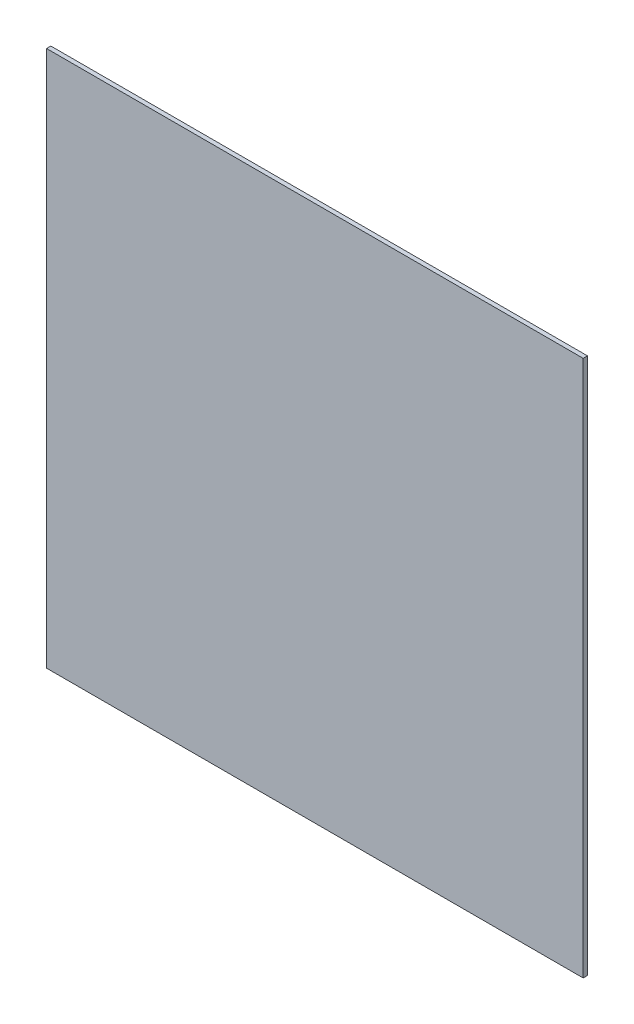
ISO-10303-21;
HEADER;
FILE_DESCRIPTION(('STEP AP214'),'2;1');
FILE_NAME('part.step','',(''),(''),'','','');
FILE_SCHEMA(('AUTOMOTIVE_DESIGN { 1 0 10303 214 1 1 1 1 }'));
ENDSEC;
DATA;
#1=APPLICATION_CONTEXT('core data for automotive mechanical design processes');
#2=APPLICATION_PROTOCOL_DEFINITION('international standard','automotive_design',2000,#1);
#3=PRODUCT_CONTEXT('',#1,'mechanical');
#4=PRODUCT('Part','Part','',(#3));
#5=PRODUCT_RELATED_PRODUCT_CATEGORY('part','',(#4));
#6=PRODUCT_DEFINITION_FORMATION('','',#4);
#7=PRODUCT_DEFINITION_CONTEXT('part definition',#1,'design');
#8=PRODUCT_DEFINITION('design','',#6,#7);
#9=PRODUCT_DEFINITION_SHAPE('','',#8);
#10=(LENGTH_UNIT() NAMED_UNIT(*) SI_UNIT(.MILLI.,.METRE.));
#11=(NAMED_UNIT(*) PLANE_ANGLE_UNIT() SI_UNIT($,.RADIAN.));
#12=(NAMED_UNIT(*) SI_UNIT($,.STERADIAN.) SOLID_ANGLE_UNIT());
#13=UNCERTAINTY_MEASURE_WITH_UNIT(LENGTH_MEASURE(1.E-05),#10,'distance_accuracy_value','');
#14=(GEOMETRIC_REPRESENTATION_CONTEXT(3) GLOBAL_UNCERTAINTY_ASSIGNED_CONTEXT((#13)) GLOBAL_UNIT_ASSIGNED_CONTEXT((#10,
#11,#12)) REPRESENTATION_CONTEXT('',''));
#15=CARTESIAN_POINT('',(0.,0.,0.));
#16=DIRECTION('',(0.,0.,1.));
#17=DIRECTION('',(1.,0.,0.));
#18=AXIS2_PLACEMENT_3D('',#15,#16,#17);
#19=CARTESIAN_POINT('',(0.,0.,0.02));
#20=DIRECTION('',(0.,0.,-1.));
#21=DIRECTION('',(0.,1.,0.));
#22=AXIS2_PLACEMENT_3D('',#19,#20,#21);
#23=PLANE('',#22);
#24=DIRECTION('',(0.,1.,0.));
#25=VECTOR('',#24,1.);
#26=CARTESIAN_POINT('',(-1.25,0.,0.02));
#27=LINE('',#26,#25);
#28=CARTESIAN_POINT('',(-1.25,1.25,0.02));
#29=VERTEX_POINT('',#28);
#30=CARTESIAN_POINT('',(-1.25,-1.25,0.02));
#31=VERTEX_POINT('',#30);
#32=EDGE_CURVE('E20',#29,#31,#27,.F.);
#33=ORIENTED_EDGE('',*,*,#32,.T.);
#34=DIRECTION('',(1.,0.,0.));
#35=VECTOR('',#34,1.);
#36=CARTESIAN_POINT('',(0.,-1.25,0.02));
#37=LINE('',#36,#35);
#38=CARTESIAN_POINT('',(1.25,-1.25,0.02));
#39=VERTEX_POINT('',#38);
#40=EDGE_CURVE('E81',#31,#39,#37,.T.);
#41=ORIENTED_EDGE('',*,*,#40,.T.);
#42=DIRECTION('',(0.,1.,0.));
#43=VECTOR('',#42,1.);
#44=CARTESIAN_POINT('',(1.25,0.,0.02));
#45=LINE('',#44,#43);
#46=CARTESIAN_POINT('',(1.25,1.25,0.02));
#47=VERTEX_POINT('',#46);
#48=EDGE_CURVE('E68',#39,#47,#45,.T.);
#49=ORIENTED_EDGE('',*,*,#48,.T.);
#50=DIRECTION('',(1.,0.,0.));
#51=VECTOR('',#50,1.);
#52=CARTESIAN_POINT('',(0.,1.25,0.02));
#53=LINE('',#52,#51);
#54=EDGE_CURVE('E55',#47,#29,#53,.F.);
#55=ORIENTED_EDGE('',*,*,#54,.T.);
#56=EDGE_LOOP('',(#33,#41,#49,#55));
#57=FACE_BOUND('',#56,.T.);
#58=ADVANCED_FACE('F17',(#57),#23,.F.);
#59=CARTESIAN_POINT('',(-1.25,0.,0.01));
#60=DIRECTION('',(1.,0.,0.));
#61=DIRECTION('',(0.,0.,-1.));
#62=AXIS2_PLACEMENT_3D('',#59,#60,#61);
#63=PLANE('',#62);
#64=DIRECTION('',(0.,0.,-1.));
#65=VECTOR('',#64,1.);
#66=CARTESIAN_POINT('',(-1.25,1.25,0.01));
#67=LINE('',#66,#65);
#68=CARTESIAN_POINT('',(-1.25,1.25,0.));
#69=VERTEX_POINT('',#68);
#70=EDGE_CURVE('E61',#29,#69,#67,.T.);
#71=ORIENTED_EDGE('',*,*,#70,.T.);
#72=DIRECTION('',(0.,1.,0.));
#73=VECTOR('',#72,1.);
#74=CARTESIAN_POINT('',(-1.25,0.,0.));
#75=LINE('',#74,#73);
#76=CARTESIAN_POINT('',(-1.25,-1.25,0.));
#77=VERTEX_POINT('',#76);
#78=EDGE_CURVE('E83',#77,#69,#75,.T.);
#79=ORIENTED_EDGE('',*,*,#78,.F.);
#80=DIRECTION('',(0.,0.,1.));
#81=VECTOR('',#80,1.);
#82=CARTESIAN_POINT('',(-1.25,-1.25,0.01));
#83=LINE('',#82,#81);
#84=EDGE_CURVE('E64',#77,#31,#83,.T.);
#85=ORIENTED_EDGE('',*,*,#84,.T.);
#86=ORIENTED_EDGE('',*,*,#32,.F.);
#87=EDGE_LOOP('',(#71,#79,#85,#86));
#88=FACE_BOUND('',#87,.T.);
#89=ADVANCED_FACE('F60',(#88),#63,.F.);
#90=CARTESIAN_POINT('',(0.,1.25,0.01));
#91=DIRECTION('',(0.,-1.,0.));
#92=DIRECTION('',(0.,0.,-1.));
#93=AXIS2_PLACEMENT_3D('',#90,#91,#92);
#94=PLANE('',#93);
#95=DIRECTION('',(0.,0.,1.));
#96=VECTOR('',#95,1.);
#97=CARTESIAN_POINT('',(1.25,1.25,0.01));
#98=LINE('',#97,#96);
#99=CARTESIAN_POINT('',(1.25,1.25,0.));
#100=VERTEX_POINT('',#99);
#101=EDGE_CURVE('E70',#47,#100,#98,.F.);
#102=ORIENTED_EDGE('',*,*,#101,.T.);
#103=DIRECTION('',(1.,0.,0.));
#104=VECTOR('',#103,1.);
#105=CARTESIAN_POINT('',(0.,1.25,0.));
#106=LINE('',#105,#104);
#107=EDGE_CURVE('E74',#69,#100,#106,.T.);
#108=ORIENTED_EDGE('',*,*,#107,.F.);
#109=ORIENTED_EDGE('',*,*,#70,.F.);
#110=ORIENTED_EDGE('',*,*,#54,.F.);
#111=EDGE_LOOP('',(#102,#108,#109,#110));
#112=FACE_BOUND('',#111,.T.);
#113=ADVANCED_FACE('F72',(#112),#94,.F.);
#114=CARTESIAN_POINT('',(1.25,0.,0.01));
#115=DIRECTION('',(-1.,0.,0.));
#116=DIRECTION('',(0.,0.,1.));
#117=AXIS2_PLACEMENT_3D('',#114,#115,#116);
#118=PLANE('',#117);
#119=DIRECTION('',(0.,0.,1.));
#120=VECTOR('',#119,1.);
#121=CARTESIAN_POINT('',(1.25,-1.25,0.01));
#122=LINE('',#121,#120);
#123=CARTESIAN_POINT('',(1.25,-1.25,0.));
#124=VERTEX_POINT('',#123);
#125=EDGE_CURVE('E35',#39,#124,#122,.F.);
#126=ORIENTED_EDGE('',*,*,#125,.T.);
#127=DIRECTION('',(0.,1.,0.));
#128=VECTOR('',#127,1.);
#129=CARTESIAN_POINT('',(1.25,0.,0.));
#130=LINE('',#129,#128);
#131=EDGE_CURVE('E26',#100,#124,#130,.F.);
#132=ORIENTED_EDGE('',*,*,#131,.F.);
#133=ORIENTED_EDGE('',*,*,#101,.F.);
#134=ORIENTED_EDGE('',*,*,#48,.F.);
#135=EDGE_LOOP('',(#126,#132,#133,#134));
#136=FACE_BOUND('',#135,.T.);
#137=ADVANCED_FACE('F89',(#136),#118,.F.);
#138=CARTESIAN_POINT('',(0.,-1.25,0.01));
#139=DIRECTION('',(0.,1.,0.));
#140=DIRECTION('',(0.,0.,1.));
#141=AXIS2_PLACEMENT_3D('',#138,#139,#140);
#142=PLANE('',#141);
#143=ORIENTED_EDGE('',*,*,#84,.F.);
#144=DIRECTION('',(1.,0.,0.));
#145=VECTOR('',#144,1.);
#146=CARTESIAN_POINT('',(0.,-1.25,0.));
#147=LINE('',#146,#145);
#148=EDGE_CURVE('E11',#124,#77,#147,.F.);
#149=ORIENTED_EDGE('',*,*,#148,.F.);
#150=ORIENTED_EDGE('',*,*,#125,.F.);
#151=ORIENTED_EDGE('',*,*,#40,.F.);
#152=EDGE_LOOP('',(#143,#149,#150,#151));
#153=FACE_BOUND('',#152,.T.);
#154=ADVANCED_FACE('F91',(#153),#142,.F.);
#155=CARTESIAN_POINT('',(0.,0.,0.));
#156=DIRECTION('',(0.,0.,-1.));
#157=DIRECTION('',(0.,1.,0.));
#158=AXIS2_PLACEMENT_3D('',#155,#156,#157);
#159=PLANE('',#158);
#160=ORIENTED_EDGE('',*,*,#131,.T.);
#161=ORIENTED_EDGE('',*,*,#148,.T.);
#162=ORIENTED_EDGE('',*,*,#78,.T.);
#163=ORIENTED_EDGE('',*,*,#107,.T.);
#164=EDGE_LOOP('',(#160,#161,#162,#163));
#165=FACE_BOUND('',#164,.T.);
#166=ADVANCED_FACE('F88',(#165),#159,.T.);
#167=CLOSED_SHELL('',(#58,#89,#113,#137,#154,#166));
#168=MANIFOLD_SOLID_BREP('B1',#167);
#169=ADVANCED_BREP_SHAPE_REPRESENTATION('',(#18,#168),#14);
#170=SHAPE_DEFINITION_REPRESENTATION(#9,#169);
ENDSEC;
END-ISO-10303-21;
